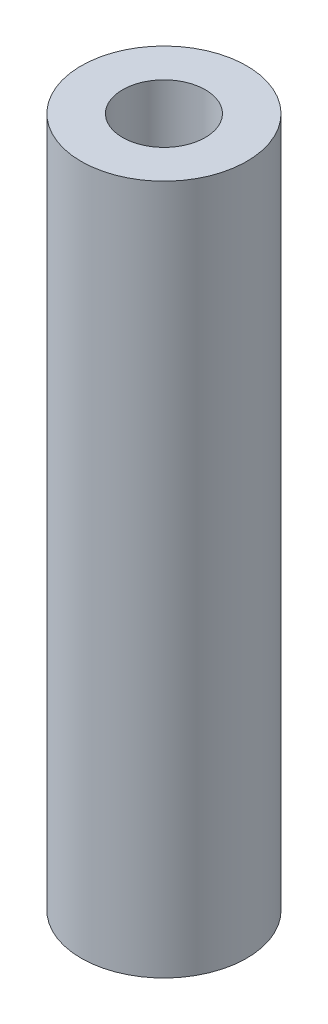
ISO-10303-21;
HEADER;
FILE_DESCRIPTION(('STEP AP214'),'2;1');
FILE_NAME('part.step','',(''),(''),'','','');
FILE_SCHEMA(('AUTOMOTIVE_DESIGN { 1 0 10303 214 1 1 1 1 }'));
ENDSEC;
DATA;
#1=APPLICATION_CONTEXT('core data for automotive mechanical design processes');
#2=APPLICATION_PROTOCOL_DEFINITION('international standard','automotive_design',2000,#1);
#3=PRODUCT_CONTEXT('',#1,'mechanical');
#4=PRODUCT('Part','Part','',(#3));
#5=PRODUCT_RELATED_PRODUCT_CATEGORY('part','',(#4));
#6=PRODUCT_DEFINITION_FORMATION('','',#4);
#7=PRODUCT_DEFINITION_CONTEXT('part definition',#1,'design');
#8=PRODUCT_DEFINITION('design','',#6,#7);
#9=PRODUCT_DEFINITION_SHAPE('','',#8);
#10=(LENGTH_UNIT() NAMED_UNIT(*) SI_UNIT(.MILLI.,.METRE.));
#11=(NAMED_UNIT(*) PLANE_ANGLE_UNIT() SI_UNIT($,.RADIAN.));
#12=(NAMED_UNIT(*) SI_UNIT($,.STERADIAN.) SOLID_ANGLE_UNIT());
#13=UNCERTAINTY_MEASURE_WITH_UNIT(LENGTH_MEASURE(1.E-05),#10,'distance_accuracy_value','');
#14=(GEOMETRIC_REPRESENTATION_CONTEXT(3) GLOBAL_UNCERTAINTY_ASSIGNED_CONTEXT((#13)) GLOBAL_UNIT_ASSIGNED_CONTEXT((#10,
#11,#12)) REPRESENTATION_CONTEXT('',''));
#15=CARTESIAN_POINT('',(0.,0.,0.));
#16=DIRECTION('',(0.,0.,1.));
#17=DIRECTION('',(1.,0.,0.));
#18=AXIS2_PLACEMENT_3D('',#15,#16,#17);
#19=CARTESIAN_POINT('',(0.,25.,0.));
#20=DIRECTION('',(0.,1.,0.));
#21=DIRECTION('',(0.,0.,1.));
#22=AXIS2_PLACEMENT_3D('',#19,#20,#21);
#23=PLANE('',#22);
#24=CARTESIAN_POINT('',(0.,25.,0.));
#25=DIRECTION('',(0.,1.,0.));
#26=DIRECTION('',(0.,0.,1.));
#27=AXIS2_PLACEMENT_3D('',#24,#25,#26);
#28=CIRCLE('',#27,3.);
#29=CARTESIAN_POINT('',(0.,25.,3.));
#30=VERTEX_POINT('',#29);
#31=EDGE_CURVE('E10',#30,#30,#28,.T.);
#32=ORIENTED_EDGE('',*,*,#31,.T.);
#33=EDGE_LOOP('',(#32));
#34=FACE_BOUND('',#33,.T.);
#35=CARTESIAN_POINT('',(0.,25.,0.));
#36=DIRECTION('',(0.,1.,0.));
#37=DIRECTION('',(0.,0.,1.));
#38=AXIS2_PLACEMENT_3D('',#35,#36,#37);
#39=CIRCLE('',#38,1.5);
#40=CARTESIAN_POINT('',(0.,25.,1.5));
#41=VERTEX_POINT('',#40);
#42=EDGE_CURVE('E56',#41,#41,#39,.T.);
#43=ORIENTED_EDGE('',*,*,#42,.F.);
#44=EDGE_LOOP('',(#43));
#45=FACE_BOUND('',#44,.T.);
#46=ADVANCED_FACE('F43',(#34,#45),#23,.T.);
#47=CARTESIAN_POINT('',(0.,0.,0.));
#48=DIRECTION('',(0.,1.,0.));
#49=DIRECTION('',(0.,0.,1.));
#50=AXIS2_PLACEMENT_3D('',#47,#48,#49);
#51=PLANE('',#50);
#52=CARTESIAN_POINT('',(0.,0.,0.));
#53=DIRECTION('',(0.,1.,0.));
#54=DIRECTION('',(0.,0.,1.));
#55=AXIS2_PLACEMENT_3D('',#52,#53,#54);
#56=CIRCLE('',#55,3.);
#57=CARTESIAN_POINT('',(0.,0.,3.));
#58=VERTEX_POINT('',#57);
#59=EDGE_CURVE('E47',#58,#58,#56,.T.);
#60=ORIENTED_EDGE('',*,*,#59,.F.);
#61=EDGE_LOOP('',(#60));
#62=FACE_BOUND('',#61,.T.);
#63=CARTESIAN_POINT('',(0.,0.,0.));
#64=DIRECTION('',(0.,1.,0.));
#65=DIRECTION('',(0.,0.,1.));
#66=AXIS2_PLACEMENT_3D('',#63,#64,#65);
#67=CIRCLE('',#66,1.5);
#68=CARTESIAN_POINT('',(0.,0.,1.5));
#69=VERTEX_POINT('',#68);
#70=EDGE_CURVE('E58',#69,#69,#67,.T.);
#71=ORIENTED_EDGE('',*,*,#70,.T.);
#72=EDGE_LOOP('',(#71));
#73=FACE_BOUND('',#72,.T.);
#74=ADVANCED_FACE('F70',(#62,#73),#51,.F.);
#75=CARTESIAN_POINT('',(0.,25.,0.));
#76=DIRECTION('',(0.,-1.,0.));
#77=DIRECTION('',(0.,0.,-1.));
#78=AXIS2_PLACEMENT_3D('',#75,#76,#77);
#79=CYLINDRICAL_SURFACE('',#78,3.);
#80=ORIENTED_EDGE('',*,*,#31,.F.);
#81=EDGE_LOOP('',(#80));
#82=FACE_BOUND('',#81,.T.);
#83=ORIENTED_EDGE('',*,*,#59,.T.);
#84=EDGE_LOOP('',(#83));
#85=FACE_BOUND('',#84,.T.);
#86=ADVANCED_FACE('F45',(#82,#85),#79,.T.);
#87=CARTESIAN_POINT('',(0.,25.,0.));
#88=DIRECTION('',(0.,-1.,0.));
#89=DIRECTION('',(0.,0.,-1.));
#90=AXIS2_PLACEMENT_3D('',#87,#88,#89);
#91=CYLINDRICAL_SURFACE('',#90,1.5);
#92=ORIENTED_EDGE('',*,*,#42,.T.);
#93=EDGE_LOOP('',(#92));
#94=FACE_BOUND('',#93,.T.);
#95=ORIENTED_EDGE('',*,*,#70,.F.);
#96=EDGE_LOOP('',(#95));
#97=FACE_BOUND('',#96,.T.);
#98=ADVANCED_FACE('F66',(#94,#97),#91,.F.);
#99=CLOSED_SHELL('',(#46,#74,#86,#98));
#100=MANIFOLD_SOLID_BREP('B2',#99);
#101=ADVANCED_BREP_SHAPE_REPRESENTATION('',(#18,#100),#14);
#102=SHAPE_DEFINITION_REPRESENTATION(#9,#101);
ENDSEC;
END-ISO-10303-21;
